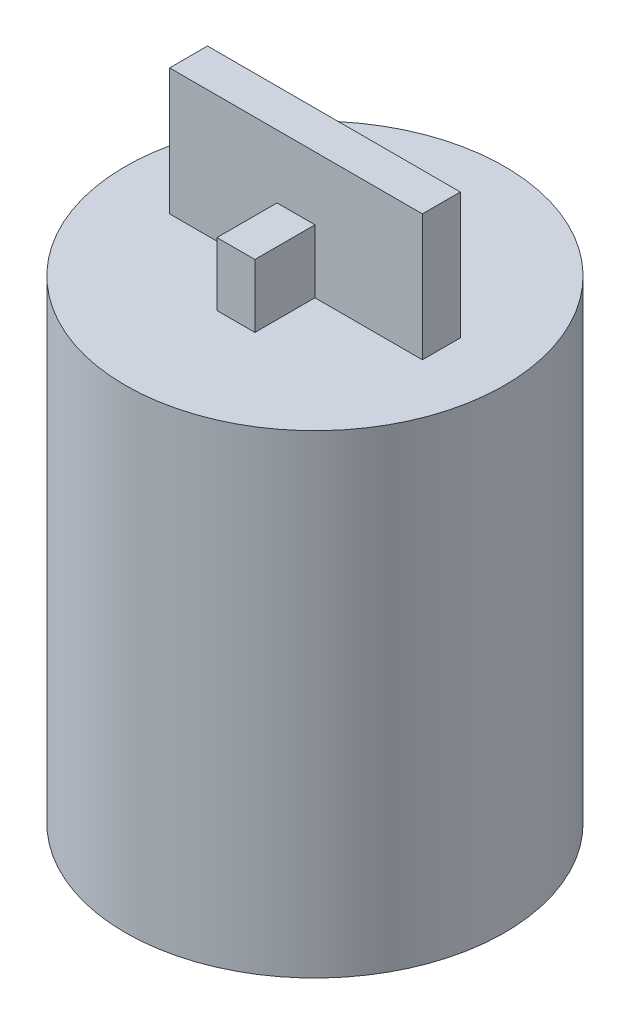
ISO-10303-21;
HEADER;
FILE_DESCRIPTION(('STEP AP214'),'2;1');
FILE_NAME('part.step','',(''),(''),'','','');
FILE_SCHEMA(('AUTOMOTIVE_DESIGN { 1 0 10303 214 1 1 1 1 }'));
ENDSEC;
DATA;
#1=APPLICATION_CONTEXT('core data for automotive mechanical design processes');
#2=APPLICATION_PROTOCOL_DEFINITION('international standard','automotive_design',2000,#1);
#3=PRODUCT_CONTEXT('',#1,'mechanical');
#4=PRODUCT('Part','Part','',(#3));
#5=PRODUCT_RELATED_PRODUCT_CATEGORY('part','',(#4));
#6=PRODUCT_DEFINITION_FORMATION('','',#4);
#7=PRODUCT_DEFINITION_CONTEXT('part definition',#1,'design');
#8=PRODUCT_DEFINITION('design','',#6,#7);
#9=PRODUCT_DEFINITION_SHAPE('','',#8);
#10=(LENGTH_UNIT() NAMED_UNIT(*) SI_UNIT(.MILLI.,.METRE.));
#11=(NAMED_UNIT(*) PLANE_ANGLE_UNIT() SI_UNIT($,.RADIAN.));
#12=(NAMED_UNIT(*) SI_UNIT($,.STERADIAN.) SOLID_ANGLE_UNIT());
#13=UNCERTAINTY_MEASURE_WITH_UNIT(LENGTH_MEASURE(1.E-05),#10,'distance_accuracy_value','');
#14=(GEOMETRIC_REPRESENTATION_CONTEXT(3) GLOBAL_UNCERTAINTY_ASSIGNED_CONTEXT((#13)) GLOBAL_UNIT_ASSIGNED_CONTEXT((#10,
#11,#12)) REPRESENTATION_CONTEXT('',''));
#15=CARTESIAN_POINT('',(0.,0.,0.));
#16=DIRECTION('',(0.,0.,1.));
#17=DIRECTION('',(1.,0.,0.));
#18=AXIS2_PLACEMENT_3D('',#15,#16,#17);
#19=CARTESIAN_POINT('',(0.,-7.5,0.));
#20=DIRECTION('',(0.,1.,0.));
#21=DIRECTION('',(0.,0.,1.));
#22=AXIS2_PLACEMENT_3D('',#19,#20,#21);
#23=PLANE('',#22);
#24=CARTESIAN_POINT('',(0.,-7.5,0.));
#25=DIRECTION('',(0.,1.,0.));
#26=DIRECTION('',(0.,0.,1.));
#27=AXIS2_PLACEMENT_3D('',#24,#25,#26);
#28=CIRCLE('',#27,3.);
#29=CARTESIAN_POINT('',(0.,-7.5,3.));
#30=VERTEX_POINT('',#29);
#31=EDGE_CURVE('E313',#30,#30,#28,.T.);
#32=ORIENTED_EDGE('',*,*,#31,.F.);
#33=EDGE_LOOP('',(#32));
#34=FACE_BOUND('',#33,.T.);
#35=DIRECTION('',(0.,0.,1.));
#36=VECTOR('',#35,1.);
#37=CARTESIAN_POINT('',(-1.13002976164114,-7.5,-2.23002976164114));
#38=LINE('',#37,#36);
#39=CARTESIAN_POINT('',(-1.13002976164114,-7.5,-2.23002976164114));
#40=VERTEX_POINT('',#39);
#41=CARTESIAN_POINT('',(-1.13002976164114,-7.5,-1.13002976164114));
#42=VERTEX_POINT('',#41);
#43=EDGE_CURVE('E288',#40,#42,#38,.T.);
#44=ORIENTED_EDGE('',*,*,#43,.T.);
#45=DIRECTION('',(-1.,0.,0.));
#46=VECTOR('',#45,1.);
#47=CARTESIAN_POINT('',(2.23002976164114,-7.5,-1.13002976164114));
#48=LINE('',#47,#46);
#49=CARTESIAN_POINT('',(-2.23002976164114,-7.5,-1.13002976164114));
#50=VERTEX_POINT('',#49);
#51=EDGE_CURVE('E240',#42,#50,#48,.T.);
#52=ORIENTED_EDGE('',*,*,#51,.T.);
#53=CARTESIAN_POINT('',(0.,-7.5,0.));
#54=DIRECTION('',(0.,-1.,0.));
#55=DIRECTION('',(0.,0.,-1.));
#56=AXIS2_PLACEMENT_3D('',#53,#54,#55);
#57=CIRCLE('',#56,2.5);
#58=CARTESIAN_POINT('',(-2.23002976164114,-7.5,1.13002976164114));
#59=VERTEX_POINT('',#58);
#60=EDGE_CURVE('E264',#59,#50,#57,.T.);
#61=ORIENTED_EDGE('',*,*,#60,.F.);
#62=DIRECTION('',(-1.,0.,0.));
#63=VECTOR('',#62,1.);
#64=CARTESIAN_POINT('',(2.23002976164114,-7.5,1.13002976164114));
#65=LINE('',#64,#63);
#66=CARTESIAN_POINT('',(-1.13002976164114,-7.5,1.13002976164114));
#67=VERTEX_POINT('',#66);
#68=EDGE_CURVE('E305',#67,#59,#65,.T.);
#69=ORIENTED_EDGE('',*,*,#68,.F.);
#70=CARTESIAN_POINT('',(-1.13002976164114,-7.5,2.23002976164114));
#71=VERTEX_POINT('',#70);
#72=EDGE_CURVE('E292',#67,#71,#38,.T.);
#73=ORIENTED_EDGE('',*,*,#72,.T.);
#74=CARTESIAN_POINT('',(0.,-7.5,0.));
#75=DIRECTION('',(0.,-1.,0.));
#76=DIRECTION('',(0.,0.,-1.));
#77=AXIS2_PLACEMENT_3D('',#74,#75,#76);
#78=CIRCLE('',#77,2.5);
#79=CARTESIAN_POINT('',(1.13002976164114,-7.5,2.23002976164114));
#80=VERTEX_POINT('',#79);
#81=EDGE_CURVE('E254',#80,#71,#78,.T.);
#82=ORIENTED_EDGE('',*,*,#81,.F.);
#83=DIRECTION('',(0.,0.,1.));
#84=VECTOR('',#83,1.);
#85=CARTESIAN_POINT('',(1.13002976164114,-7.5,-2.23002976164114));
#86=LINE('',#85,#84);
#87=CARTESIAN_POINT('',(1.13002976164114,-7.5,1.13002976164114));
#88=VERTEX_POINT('',#87);
#89=EDGE_CURVE('E287',#88,#80,#86,.T.);
#90=ORIENTED_EDGE('',*,*,#89,.F.);
#91=CARTESIAN_POINT('',(2.23002976164114,-7.5,1.13002976164114));
#92=VERTEX_POINT('',#91);
#93=EDGE_CURVE('E303',#92,#88,#65,.T.);
#94=ORIENTED_EDGE('',*,*,#93,.F.);
#95=CARTESIAN_POINT('',(0.,-7.5,0.));
#96=DIRECTION('',(0.,-1.,0.));
#97=DIRECTION('',(0.,0.,-1.));
#98=AXIS2_PLACEMENT_3D('',#95,#96,#97);
#99=CIRCLE('',#98,2.5);
#100=CARTESIAN_POINT('',(2.23002976164114,-7.5,-1.13002976164114));
#101=VERTEX_POINT('',#100);
#102=EDGE_CURVE('E78',#101,#92,#99,.T.);
#103=ORIENTED_EDGE('',*,*,#102,.F.);
#104=CARTESIAN_POINT('',(1.13002976164114,-7.5,-1.13002976164114));
#105=VERTEX_POINT('',#104);
#106=EDGE_CURVE('E306',#101,#105,#48,.T.);
#107=ORIENTED_EDGE('',*,*,#106,.T.);
#108=CARTESIAN_POINT('',(1.13002976164114,-7.5,-2.23002976164114));
#109=VERTEX_POINT('',#108);
#110=EDGE_CURVE('E283',#109,#105,#86,.T.);
#111=ORIENTED_EDGE('',*,*,#110,.F.);
#112=CARTESIAN_POINT('',(0.,-7.5,0.));
#113=DIRECTION('',(0.,-1.,0.));
#114=DIRECTION('',(0.,0.,-1.));
#115=AXIS2_PLACEMENT_3D('',#112,#113,#114);
#116=CIRCLE('',#115,2.5);
#117=EDGE_CURVE('E274',#40,#109,#116,.T.);
#118=ORIENTED_EDGE('',*,*,#117,.F.);
#119=EDGE_LOOP('',(#44,#52,#61,#69,#73,#82,#90,#94,#103,#107,#111,#118));
#120=FACE_BOUND('',#119,.T.);
#121=ADVANCED_FACE('F63',(#34,#120),#23,.F.);
#122=CARTESIAN_POINT('',(-2.,2.,-0.3));
#123=DIRECTION('',(1.,0.,0.));
#124=DIRECTION('',(0.,0.,-1.));
#125=AXIS2_PLACEMENT_3D('',#122,#123,#124);
#126=PLANE('',#125);
#127=DIRECTION('',(0.,0.,1.));
#128=VECTOR('',#127,1.);
#129=CARTESIAN_POINT('',(-2.,0.,-0.3));
#130=LINE('',#129,#128);
#131=CARTESIAN_POINT('',(-2.,0.,-0.3));
#132=VERTEX_POINT('',#131);
#133=CARTESIAN_POINT('',(-2.,0.,0.3));
#134=VERTEX_POINT('',#133);
#135=EDGE_CURVE('E366',#132,#134,#130,.T.);
#136=ORIENTED_EDGE('',*,*,#135,.T.);
#137=DIRECTION('',(0.,-1.,0.));
#138=VECTOR('',#137,1.);
#139=CARTESIAN_POINT('',(-2.,2.,0.3));
#140=LINE('',#139,#138);
#141=CARTESIAN_POINT('',(-2.,2.,0.3));
#142=VERTEX_POINT('',#141);
#143=EDGE_CURVE('E71',#142,#134,#140,.T.);
#144=ORIENTED_EDGE('',*,*,#143,.F.);
#145=DIRECTION('',(0.,0.,1.));
#146=VECTOR('',#145,1.);
#147=CARTESIAN_POINT('',(-2.,2.,-0.3));
#148=LINE('',#147,#146);
#149=CARTESIAN_POINT('',(-2.,2.,-0.3));
#150=VERTEX_POINT('',#149);
#151=EDGE_CURVE('E367',#150,#142,#148,.T.);
#152=ORIENTED_EDGE('',*,*,#151,.F.);
#153=DIRECTION('',(0.,-1.,0.));
#154=VECTOR('',#153,1.);
#155=CARTESIAN_POINT('',(-2.,2.,-0.3));
#156=LINE('',#155,#154);
#157=EDGE_CURVE('E379',#150,#132,#156,.T.);
#158=ORIENTED_EDGE('',*,*,#157,.T.);
#159=EDGE_LOOP('',(#136,#144,#152,#158));
#160=FACE_BOUND('',#159,.T.);
#161=ADVANCED_FACE('F65',(#160),#126,.F.);
#162=CARTESIAN_POINT('',(-2.,2.,0.3));
#163=DIRECTION('',(0.,0.,-1.));
#164=DIRECTION('',(-1.,0.,0.));
#165=AXIS2_PLACEMENT_3D('',#162,#163,#164);
#166=PLANE('',#165);
#167=DIRECTION('',(1.,0.,0.));
#168=VECTOR('',#167,1.);
#169=CARTESIAN_POINT('',(-2.,0.,0.3));
#170=LINE('',#169,#168);
#171=CARTESIAN_POINT('',(-0.299999999999999,0.,0.3));
#172=VERTEX_POINT('',#171);
#173=EDGE_CURVE('E383',#134,#172,#170,.T.);
#174=ORIENTED_EDGE('',*,*,#173,.T.);
#175=DIRECTION('',(0.,1.,0.));
#176=VECTOR('',#175,1.);
#177=CARTESIAN_POINT('',(-0.299999999999999,2.,0.3));
#178=LINE('',#177,#176);
#179=CARTESIAN_POINT('',(-0.299999999999999,1.,0.3));
#180=VERTEX_POINT('',#179);
#181=EDGE_CURVE('E86',#172,#180,#178,.T.);
#182=ORIENTED_EDGE('',*,*,#181,.T.);
#183=DIRECTION('',(-1.,0.,0.));
#184=VECTOR('',#183,1.);
#185=CARTESIAN_POINT('',(-2.,1.,0.3));
#186=LINE('',#185,#184);
#187=CARTESIAN_POINT('',(0.300000000000001,1.,0.3));
#188=VERTEX_POINT('',#187);
#189=EDGE_CURVE('E364',#188,#180,#186,.T.);
#190=ORIENTED_EDGE('',*,*,#189,.F.);
#191=DIRECTION('',(0.,1.,0.));
#192=VECTOR('',#191,1.);
#193=CARTESIAN_POINT('',(0.300000000000001,2.,0.3));
#194=LINE('',#193,#192);
#195=CARTESIAN_POINT('',(0.300000000000001,0.,0.3));
#196=VERTEX_POINT('',#195);
#197=EDGE_CURVE('E358',#196,#188,#194,.T.);
#198=ORIENTED_EDGE('',*,*,#197,.F.);
#199=CARTESIAN_POINT('',(2.,0.,0.3));
#200=VERTEX_POINT('',#199);
#201=EDGE_CURVE('E382',#196,#200,#170,.T.);
#202=ORIENTED_EDGE('',*,*,#201,.T.);
#203=DIRECTION('',(0.,-1.,0.));
#204=VECTOR('',#203,1.);
#205=CARTESIAN_POINT('',(2.,2.,0.3));
#206=LINE('',#205,#204);
#207=CARTESIAN_POINT('',(2.,2.,0.3));
#208=VERTEX_POINT('',#207);
#209=EDGE_CURVE('E394',#208,#200,#206,.T.);
#210=ORIENTED_EDGE('',*,*,#209,.F.);
#211=DIRECTION('',(1.,0.,0.));
#212=VECTOR('',#211,1.);
#213=CARTESIAN_POINT('',(-2.,2.,0.3));
#214=LINE('',#213,#212);
#215=EDGE_CURVE('E370',#142,#208,#214,.T.);
#216=ORIENTED_EDGE('',*,*,#215,.F.);
#217=ORIENTED_EDGE('',*,*,#143,.T.);
#218=EDGE_LOOP('',(#174,#182,#190,#198,#202,#210,#216,#217));
#219=FACE_BOUND('',#218,.T.);
#220=ADVANCED_FACE('F398',(#219),#166,.F.);
#221=CARTESIAN_POINT('',(2.,2.,-0.3));
#222=DIRECTION('',(1.,0.,0.));
#223=DIRECTION('',(0.,0.,-1.));
#224=AXIS2_PLACEMENT_3D('',#221,#222,#223);
#225=PLANE('',#224);
#226=DIRECTION('',(0.,0.,1.));
#227=VECTOR('',#226,1.);
#228=CARTESIAN_POINT('',(2.,0.,-0.3));
#229=LINE('',#228,#227);
#230=CARTESIAN_POINT('',(2.,0.,-0.3));
#231=VERTEX_POINT('',#230);
#232=EDGE_CURVE('E385',#231,#200,#229,.T.);
#233=ORIENTED_EDGE('',*,*,#232,.F.);
#234=DIRECTION('',(0.,-1.,0.));
#235=VECTOR('',#234,1.);
#236=CARTESIAN_POINT('',(2.,2.,-0.3));
#237=LINE('',#236,#235);
#238=CARTESIAN_POINT('',(2.,2.,-0.3));
#239=VERTEX_POINT('',#238);
#240=EDGE_CURVE('E391',#239,#231,#237,.T.);
#241=ORIENTED_EDGE('',*,*,#240,.F.);
#242=DIRECTION('',(0.,0.,1.));
#243=VECTOR('',#242,1.);
#244=CARTESIAN_POINT('',(2.,2.,-0.3));
#245=LINE('',#244,#243);
#246=EDGE_CURVE('E373',#239,#208,#245,.T.);
#247=ORIENTED_EDGE('',*,*,#246,.T.);
#248=ORIENTED_EDGE('',*,*,#209,.T.);
#249=EDGE_LOOP('',(#233,#241,#247,#248));
#250=FACE_BOUND('',#249,.T.);
#251=ADVANCED_FACE('F475',(#250),#225,.T.);
#252=CARTESIAN_POINT('',(-2.,2.,-0.3));
#253=DIRECTION('',(0.,0.,-1.));
#254=DIRECTION('',(-1.,0.,0.));
#255=AXIS2_PLACEMENT_3D('',#252,#253,#254);
#256=PLANE('',#255);
#257=DIRECTION('',(0.,1.,0.));
#258=VECTOR('',#257,1.);
#259=CARTESIAN_POINT('',(-0.299999999999999,2.,-0.3));
#260=LINE('',#259,#258);
#261=CARTESIAN_POINT('',(-0.299999999999999,0.,-0.3));
#262=VERTEX_POINT('',#261);
#263=CARTESIAN_POINT('',(-0.299999999999999,1.,-0.3));
#264=VERTEX_POINT('',#263);
#265=EDGE_CURVE('E361',#262,#264,#260,.T.);
#266=ORIENTED_EDGE('',*,*,#265,.F.);
#267=DIRECTION('',(1.,0.,0.));
#268=VECTOR('',#267,1.);
#269=CARTESIAN_POINT('',(-2.,0.,-0.3));
#270=LINE('',#269,#268);
#271=EDGE_CURVE('E371',#132,#262,#270,.T.);
#272=ORIENTED_EDGE('',*,*,#271,.F.);
#273=ORIENTED_EDGE('',*,*,#157,.F.);
#274=DIRECTION('',(1.,0.,0.));
#275=VECTOR('',#274,1.);
#276=CARTESIAN_POINT('',(-2.,2.,-0.3));
#277=LINE('',#276,#275);
#278=EDGE_CURVE('E376',#150,#239,#277,.T.);
#279=ORIENTED_EDGE('',*,*,#278,.T.);
#280=ORIENTED_EDGE('',*,*,#240,.T.);
#281=CARTESIAN_POINT('',(0.300000000000001,0.,-0.3));
#282=VERTEX_POINT('',#281);
#283=EDGE_CURVE('E387',#282,#231,#270,.T.);
#284=ORIENTED_EDGE('',*,*,#283,.F.);
#285=DIRECTION('',(0.,1.,0.));
#286=VECTOR('',#285,1.);
#287=CARTESIAN_POINT('',(0.300000000000001,2.,-0.3));
#288=LINE('',#287,#286);
#289=CARTESIAN_POINT('',(0.300000000000001,1.,-0.3));
#290=VERTEX_POINT('',#289);
#291=EDGE_CURVE('E347',#282,#290,#288,.T.);
#292=ORIENTED_EDGE('',*,*,#291,.T.);
#293=DIRECTION('',(-1.,0.,0.));
#294=VECTOR('',#293,1.);
#295=CARTESIAN_POINT('',(-2.,1.,-0.3));
#296=LINE('',#295,#294);
#297=EDGE_CURVE('E13',#290,#264,#296,.T.);
#298=ORIENTED_EDGE('',*,*,#297,.T.);
#299=EDGE_LOOP('',(#266,#272,#273,#279,#280,#284,#292,#298));
#300=FACE_BOUND('',#299,.T.);
#301=ADVANCED_FACE('F471',(#300),#256,.T.);
#302=CARTESIAN_POINT('',(0.,2.,0.));
#303=DIRECTION('',(0.,1.,0.));
#304=DIRECTION('',(0.,0.,1.));
#305=AXIS2_PLACEMENT_3D('',#302,#303,#304);
#306=PLANE('',#305);
#307=ORIENTED_EDGE('',*,*,#151,.T.);
#308=ORIENTED_EDGE('',*,*,#215,.T.);
#309=ORIENTED_EDGE('',*,*,#246,.F.);
#310=ORIENTED_EDGE('',*,*,#278,.F.);
#311=EDGE_LOOP('',(#307,#308,#309,#310));
#312=FACE_BOUND('',#311,.T.);
#313=ADVANCED_FACE('F456',(#312),#306,.T.);
#314=CARTESIAN_POINT('',(-0.299999999999999,1.,-1.25));
#315=DIRECTION('',(0.,0.,-1.));
#316=DIRECTION('',(-1.,0.,0.));
#317=AXIS2_PLACEMENT_3D('',#314,#315,#316);
#318=PLANE('',#317);
#319=DIRECTION('',(1.,0.,0.));
#320=VECTOR('',#319,1.);
#321=CARTESIAN_POINT('',(-0.299999999999999,0.,-1.25));
#322=LINE('',#321,#320);
#323=CARTESIAN_POINT('',(-0.299999999999999,0.,-1.25));
#324=VERTEX_POINT('',#323);
#325=CARTESIAN_POINT('',(0.300000000000001,0.,-1.25));
#326=VERTEX_POINT('',#325);
#327=EDGE_CURVE('E335',#324,#326,#322,.T.);
#328=ORIENTED_EDGE('',*,*,#327,.F.);
#329=DIRECTION('',(0.,-1.,0.));
#330=VECTOR('',#329,1.);
#331=CARTESIAN_POINT('',(-0.299999999999999,1.,-1.25));
#332=LINE('',#331,#330);
#333=CARTESIAN_POINT('',(-0.299999999999999,1.,-1.25));
#334=VERTEX_POINT('',#333);
#335=EDGE_CURVE('E332',#334,#324,#332,.T.);
#336=ORIENTED_EDGE('',*,*,#335,.F.);
#337=DIRECTION('',(1.,0.,0.));
#338=VECTOR('',#337,1.);
#339=CARTESIAN_POINT('',(-0.299999999999999,1.,-1.25));
#340=LINE('',#339,#338);
#341=CARTESIAN_POINT('',(0.300000000000001,1.,-1.25));
#342=VERTEX_POINT('',#341);
#343=EDGE_CURVE('E322',#334,#342,#340,.T.);
#344=ORIENTED_EDGE('',*,*,#343,.T.);
#345=DIRECTION('',(0.,-1.,0.));
#346=VECTOR('',#345,1.);
#347=CARTESIAN_POINT('',(0.300000000000001,1.,-1.25));
#348=LINE('',#347,#346);
#349=EDGE_CURVE('E351',#342,#326,#348,.T.);
#350=ORIENTED_EDGE('',*,*,#349,.T.);
#351=EDGE_LOOP('',(#328,#336,#344,#350));
#352=FACE_BOUND('',#351,.T.);
#353=ADVANCED_FACE('F448',(#352),#318,.T.);
#354=CARTESIAN_POINT('',(0.,1.,0.));
#355=DIRECTION('',(0.,-1.,0.));
#356=DIRECTION('',(0.,0.,-1.));
#357=AXIS2_PLACEMENT_3D('',#354,#355,#356);
#358=PLANE('',#357);
#359=ORIENTED_EDGE('',*,*,#297,.F.);
#360=DIRECTION('',(0.,0.,-1.));
#361=VECTOR('',#360,1.);
#362=CARTESIAN_POINT('',(0.300000000000001,1.,1.25));
#363=LINE('',#362,#361);
#364=EDGE_CURVE('E326',#290,#342,#363,.T.);
#365=ORIENTED_EDGE('',*,*,#364,.T.);
#366=ORIENTED_EDGE('',*,*,#343,.F.);
#367=DIRECTION('',(0.,0.,-1.));
#368=VECTOR('',#367,1.);
#369=CARTESIAN_POINT('',(-0.299999999999999,1.,1.25));
#370=LINE('',#369,#368);
#371=EDGE_CURVE('E323',#264,#334,#370,.T.);
#372=ORIENTED_EDGE('',*,*,#371,.F.);
#373=EDGE_LOOP('',(#359,#365,#366,#372));
#374=FACE_BOUND('',#373,.T.);
#375=ADVANCED_FACE('F446',(#374),#358,.F.);
#376=CARTESIAN_POINT('',(0.300000000000001,1.,1.25));
#377=DIRECTION('',(-1.,0.,0.));
#378=DIRECTION('',(0.,0.,1.));
#379=AXIS2_PLACEMENT_3D('',#376,#377,#378);
#380=PLANE('',#379);
#381=ORIENTED_EDGE('',*,*,#291,.F.);
#382=DIRECTION('',(0.,0.,-1.));
#383=VECTOR('',#382,1.);
#384=CARTESIAN_POINT('',(0.300000000000001,0.,1.25));
#385=LINE('',#384,#383);
#386=EDGE_CURVE('E337',#282,#326,#385,.T.);
#387=ORIENTED_EDGE('',*,*,#386,.T.);
#388=ORIENTED_EDGE('',*,*,#349,.F.);
#389=ORIENTED_EDGE('',*,*,#364,.F.);
#390=EDGE_LOOP('',(#381,#387,#388,#389));
#391=FACE_BOUND('',#390,.T.);
#392=ADVANCED_FACE('F432',(#391),#380,.F.);
#393=CARTESIAN_POINT('',(-0.299999999999999,1.,1.25));
#394=DIRECTION('',(-1.,0.,0.));
#395=DIRECTION('',(0.,0.,1.));
#396=AXIS2_PLACEMENT_3D('',#393,#394,#395);
#397=PLANE('',#396);
#398=DIRECTION('',(0.,0.,-1.));
#399=VECTOR('',#398,1.);
#400=CARTESIAN_POINT('',(-0.299999999999999,0.,1.25));
#401=LINE('',#400,#399);
#402=EDGE_CURVE('E316',#262,#324,#401,.T.);
#403=ORIENTED_EDGE('',*,*,#402,.F.);
#404=ORIENTED_EDGE('',*,*,#265,.T.);
#405=ORIENTED_EDGE('',*,*,#371,.T.);
#406=ORIENTED_EDGE('',*,*,#335,.T.);
#407=EDGE_LOOP('',(#403,#404,#405,#406));
#408=FACE_BOUND('',#407,.T.);
#409=ADVANCED_FACE('F454',(#408),#397,.T.);
#410=CARTESIAN_POINT('',(0.300000000000001,1.,1.25));
#411=VERTEX_POINT('',#410);
#412=EDGE_CURVE('E327',#411,#188,#363,.T.);
#413=ORIENTED_EDGE('',*,*,#412,.T.);
#414=ORIENTED_EDGE('',*,*,#189,.T.);
#415=CARTESIAN_POINT('',(-0.299999999999999,1.,1.25));
#416=VERTEX_POINT('',#415);
#417=EDGE_CURVE('E319',#416,#180,#370,.T.);
#418=ORIENTED_EDGE('',*,*,#417,.F.);
#419=DIRECTION('',(1.,0.,0.));
#420=VECTOR('',#419,1.);
#421=CARTESIAN_POINT('',(-0.299999999999999,1.,1.25));
#422=LINE('',#421,#420);
#423=EDGE_CURVE('E330',#416,#411,#422,.T.);
#424=ORIENTED_EDGE('',*,*,#423,.T.);
#425=EDGE_LOOP('',(#413,#414,#418,#424));
#426=FACE_BOUND('',#425,.T.);
#427=ADVANCED_FACE('F413',(#426),#358,.F.);
#428=ORIENTED_EDGE('',*,*,#181,.F.);
#429=CARTESIAN_POINT('',(-0.299999999999999,0.,1.25));
#430=VERTEX_POINT('',#429);
#431=EDGE_CURVE('E333',#430,#172,#401,.T.);
#432=ORIENTED_EDGE('',*,*,#431,.F.);
#433=DIRECTION('',(0.,-1.,0.));
#434=VECTOR('',#433,1.);
#435=CARTESIAN_POINT('',(-0.299999999999999,1.,1.25));
#436=LINE('',#435,#434);
#437=EDGE_CURVE('E344',#416,#430,#436,.T.);
#438=ORIENTED_EDGE('',*,*,#437,.F.);
#439=ORIENTED_EDGE('',*,*,#417,.T.);
#440=EDGE_LOOP('',(#428,#432,#438,#439));
#441=FACE_BOUND('',#440,.T.);
#442=ADVANCED_FACE('F409',(#441),#397,.T.);
#443=CARTESIAN_POINT('',(0.300000000000001,0.,1.25));
#444=VERTEX_POINT('',#443);
#445=EDGE_CURVE('E338',#444,#196,#385,.T.);
#446=ORIENTED_EDGE('',*,*,#445,.T.);
#447=ORIENTED_EDGE('',*,*,#197,.T.);
#448=ORIENTED_EDGE('',*,*,#412,.F.);
#449=DIRECTION('',(0.,-1.,0.));
#450=VECTOR('',#449,1.);
#451=CARTESIAN_POINT('',(0.300000000000001,1.,1.25));
#452=LINE('',#451,#450);
#453=EDGE_CURVE('E348',#411,#444,#452,.T.);
#454=ORIENTED_EDGE('',*,*,#453,.T.);
#455=EDGE_LOOP('',(#446,#447,#448,#454));
#456=FACE_BOUND('',#455,.T.);
#457=ADVANCED_FACE('F419',(#456),#380,.F.);
#458=CARTESIAN_POINT('',(-0.299999999999999,1.,1.25));
#459=DIRECTION('',(0.,0.,-1.));
#460=DIRECTION('',(-1.,0.,0.));
#461=AXIS2_PLACEMENT_3D('',#458,#459,#460);
#462=PLANE('',#461);
#463=DIRECTION('',(1.,0.,0.));
#464=VECTOR('',#463,1.);
#465=CARTESIAN_POINT('',(-0.299999999999999,0.,1.25));
#466=LINE('',#465,#464);
#467=EDGE_CURVE('E341',#430,#444,#466,.T.);
#468=ORIENTED_EDGE('',*,*,#467,.T.);
#469=ORIENTED_EDGE('',*,*,#453,.F.);
#470=ORIENTED_EDGE('',*,*,#423,.F.);
#471=ORIENTED_EDGE('',*,*,#437,.T.);
#472=EDGE_LOOP('',(#468,#469,#470,#471));
#473=FACE_BOUND('',#472,.T.);
#474=ADVANCED_FACE('F421',(#473),#462,.F.);
#475=CARTESIAN_POINT('',(0.,-7.5,0.));
#476=DIRECTION('',(0.,1.,0.));
#477=DIRECTION('',(0.,0.,1.));
#478=AXIS2_PLACEMENT_3D('',#475,#476,#477);
#479=CYLINDRICAL_SURFACE('',#478,3.);
#480=ORIENTED_EDGE('',*,*,#31,.T.);
#481=EDGE_LOOP('',(#480));
#482=FACE_BOUND('',#481,.T.);
#483=CARTESIAN_POINT('',(0.,0.,0.));
#484=DIRECTION('',(0.,1.,0.));
#485=DIRECTION('',(0.,0.,1.));
#486=AXIS2_PLACEMENT_3D('',#483,#484,#485);
#487=CIRCLE('',#486,3.);
#488=CARTESIAN_POINT('',(0.,0.,3.));
#489=VERTEX_POINT('',#488);
#490=EDGE_CURVE('E253',#489,#489,#487,.T.);
#491=ORIENTED_EDGE('',*,*,#490,.F.);
#492=EDGE_LOOP('',(#491));
#493=FACE_BOUND('',#492,.T.);
#494=ADVANCED_FACE('F423',(#482,#493),#479,.T.);
#495=CARTESIAN_POINT('',(0.,0.,0.));
#496=DIRECTION('',(0.,1.,0.));
#497=DIRECTION('',(0.,0.,1.));
#498=AXIS2_PLACEMENT_3D('',#495,#496,#497);
#499=PLANE('',#498);
#500=ORIENTED_EDGE('',*,*,#135,.F.);
#501=ORIENTED_EDGE('',*,*,#271,.T.);
#502=ORIENTED_EDGE('',*,*,#402,.T.);
#503=ORIENTED_EDGE('',*,*,#327,.T.);
#504=ORIENTED_EDGE('',*,*,#386,.F.);
#505=ORIENTED_EDGE('',*,*,#283,.T.);
#506=ORIENTED_EDGE('',*,*,#232,.T.);
#507=ORIENTED_EDGE('',*,*,#201,.F.);
#508=ORIENTED_EDGE('',*,*,#445,.F.);
#509=ORIENTED_EDGE('',*,*,#467,.F.);
#510=ORIENTED_EDGE('',*,*,#431,.T.);
#511=ORIENTED_EDGE('',*,*,#173,.F.);
#512=EDGE_LOOP('',(#500,#501,#502,#503,#504,#505,#506,#507,#508,#509,#510,#511));
#513=FACE_BOUND('',#512,.T.);
#514=ORIENTED_EDGE('',*,*,#490,.T.);
#515=EDGE_LOOP('',(#514));
#516=FACE_BOUND('',#515,.T.);
#517=ADVANCED_FACE('F404',(#513,#516),#499,.T.);
#518=CARTESIAN_POINT('',(0.,-1.,0.));
#519=DIRECTION('',(0.,1.,0.));
#520=DIRECTION('',(0.,0.,1.));
#521=AXIS2_PLACEMENT_3D('',#518,#519,#520);
#522=PLANE('',#521);
#523=CARTESIAN_POINT('',(0.,-1.,0.));
#524=DIRECTION('',(0.,1.,0.));
#525=DIRECTION('',(0.,0.,1.));
#526=AXIS2_PLACEMENT_3D('',#523,#524,#525);
#527=CIRCLE('',#526,2.5);
#528=CARTESIAN_POINT('',(2.23002976164114,-1.,-1.13002976164114));
#529=VERTEX_POINT('',#528);
#530=CARTESIAN_POINT('',(2.23002976164114,-1.,1.13002976164114));
#531=VERTEX_POINT('',#530);
#532=EDGE_CURVE('E227',#529,#531,#527,.F.);
#533=ORIENTED_EDGE('',*,*,#532,.T.);
#534=DIRECTION('',(-1.,0.,0.));
#535=VECTOR('',#534,1.);
#536=CARTESIAN_POINT('',(2.23002976164114,-1.,1.13002976164114));
#537=LINE('',#536,#535);
#538=CARTESIAN_POINT('',(1.13002976164114,-1.,1.13002976164114));
#539=VERTEX_POINT('',#538);
#540=EDGE_CURVE('E234',#531,#539,#537,.T.);
#541=ORIENTED_EDGE('',*,*,#540,.T.);
#542=DIRECTION('',(0.,0.,1.));
#543=VECTOR('',#542,1.);
#544=CARTESIAN_POINT('',(1.13002976164114,-1.,-2.23002976164114));
#545=LINE('',#544,#543);
#546=CARTESIAN_POINT('',(1.13002976164114,-1.,2.23002976164114));
#547=VERTEX_POINT('',#546);
#548=EDGE_CURVE('E286',#539,#547,#545,.T.);
#549=ORIENTED_EDGE('',*,*,#548,.T.);
#550=CARTESIAN_POINT('',(0.,-1.,0.));
#551=DIRECTION('',(0.,1.,0.));
#552=DIRECTION('',(0.,0.,1.));
#553=AXIS2_PLACEMENT_3D('',#550,#551,#552);
#554=CIRCLE('',#553,2.5);
#555=CARTESIAN_POINT('',(-1.13002976164114,-1.,2.23002976164114));
#556=VERTEX_POINT('',#555);
#557=EDGE_CURVE('E257',#547,#556,#554,.F.);
#558=ORIENTED_EDGE('',*,*,#557,.T.);
#559=DIRECTION('',(0.,0.,1.));
#560=VECTOR('',#559,1.);
#561=CARTESIAN_POINT('',(-1.13002976164114,-1.,-2.23002976164114));
#562=LINE('',#561,#560);
#563=CARTESIAN_POINT('',(-1.13002976164114,-1.,1.13002976164114));
#564=VERTEX_POINT('',#563);
#565=EDGE_CURVE('E298',#564,#556,#562,.T.);
#566=ORIENTED_EDGE('',*,*,#565,.F.);
#567=CARTESIAN_POINT('',(-2.23002976164114,-1.,1.13002976164114));
#568=VERTEX_POINT('',#567);
#569=EDGE_CURVE('E241',#564,#568,#537,.T.);
#570=ORIENTED_EDGE('',*,*,#569,.T.);
#571=CARTESIAN_POINT('',(0.,-1.,0.));
#572=DIRECTION('',(0.,1.,0.));
#573=DIRECTION('',(0.,0.,1.));
#574=AXIS2_PLACEMENT_3D('',#571,#572,#573);
#575=CIRCLE('',#574,2.5);
#576=CARTESIAN_POINT('',(-2.23002976164114,-1.,-1.13002976164114));
#577=VERTEX_POINT('',#576);
#578=EDGE_CURVE('E267',#568,#577,#575,.F.);
#579=ORIENTED_EDGE('',*,*,#578,.T.);
#580=DIRECTION('',(-1.,0.,0.));
#581=VECTOR('',#580,1.);
#582=CARTESIAN_POINT('',(2.23002976164114,-1.,-1.13002976164114));
#583=LINE('',#582,#581);
#584=CARTESIAN_POINT('',(-1.13002976164114,-1.,-1.13002976164114));
#585=VERTEX_POINT('',#584);
#586=EDGE_CURVE('E310',#585,#577,#583,.T.);
#587=ORIENTED_EDGE('',*,*,#586,.F.);
#588=CARTESIAN_POINT('',(-1.13002976164114,-1.,-2.23002976164114));
#589=VERTEX_POINT('',#588);
#590=EDGE_CURVE('E295',#589,#585,#562,.T.);
#591=ORIENTED_EDGE('',*,*,#590,.F.);
#592=CARTESIAN_POINT('',(0.,-1.,0.));
#593=DIRECTION('',(0.,1.,0.));
#594=DIRECTION('',(0.,0.,1.));
#595=AXIS2_PLACEMENT_3D('',#592,#593,#594);
#596=CIRCLE('',#595,2.5);
#597=CARTESIAN_POINT('',(1.13002976164114,-1.,-2.23002976164114));
#598=VERTEX_POINT('',#597);
#599=EDGE_CURVE('E277',#589,#598,#596,.F.);
#600=ORIENTED_EDGE('',*,*,#599,.T.);
#601=CARTESIAN_POINT('',(1.13002976164114,-1.,-1.13002976164114));
#602=VERTEX_POINT('',#601);
#603=EDGE_CURVE('E293',#598,#602,#545,.T.);
#604=ORIENTED_EDGE('',*,*,#603,.T.);
#605=EDGE_CURVE('E247',#529,#602,#583,.T.);
#606=ORIENTED_EDGE('',*,*,#605,.F.);
#607=EDGE_LOOP('',(#533,#541,#549,#558,#566,#570,#579,#587,#591,#600,#604,#606));
#608=FACE_BOUND('',#607,.T.);
#609=ADVANCED_FACE('F244',(#608),#522,.F.);
#610=CARTESIAN_POINT('',(0.,5.,0.));
#611=DIRECTION('',(0.,-1.,0.));
#612=DIRECTION('',(0.,0.,-1.));
#613=AXIS2_PLACEMENT_3D('',#610,#611,#612);
#614=CYLINDRICAL_SURFACE('',#613,2.5);
#615=DIRECTION('',(0.,-1.,0.));
#616=VECTOR('',#615,1.);
#617=CARTESIAN_POINT('',(2.23002976164114,5.,-1.13002976164114));
#618=LINE('',#617,#616);
#619=EDGE_CURVE('E231',#529,#101,#618,.T.);
#620=ORIENTED_EDGE('',*,*,#619,.T.);
#621=ORIENTED_EDGE('',*,*,#102,.T.);
#622=DIRECTION('',(0.,-1.,0.));
#623=VECTOR('',#622,1.);
#624=CARTESIAN_POINT('',(2.23002976164114,5.,1.13002976164114));
#625=LINE('',#624,#623);
#626=EDGE_CURVE('E223',#531,#92,#625,.T.);
#627=ORIENTED_EDGE('',*,*,#626,.F.);
#628=ORIENTED_EDGE('',*,*,#532,.F.);
#629=EDGE_LOOP('',(#620,#621,#627,#628));
#630=FACE_BOUND('',#629,.T.);
#631=ADVANCED_FACE('F225',(#630),#614,.F.);
#632=CARTESIAN_POINT('',(0.,5.,0.));
#633=DIRECTION('',(0.,-1.,0.));
#634=DIRECTION('',(0.,0.,-1.));
#635=AXIS2_PLACEMENT_3D('',#632,#633,#634);
#636=CYLINDRICAL_SURFACE('',#635,2.5);
#637=DIRECTION('',(0.,-1.,0.));
#638=VECTOR('',#637,1.);
#639=CARTESIAN_POINT('',(-2.23002976164114,5.,1.13002976164114));
#640=LINE('',#639,#638);
#641=EDGE_CURVE('E258',#568,#59,#640,.T.);
#642=ORIENTED_EDGE('',*,*,#641,.T.);
#643=ORIENTED_EDGE('',*,*,#60,.T.);
#644=DIRECTION('',(0.,-1.,0.));
#645=VECTOR('',#644,1.);
#646=CARTESIAN_POINT('',(-2.23002976164114,5.,-1.13002976164114));
#647=LINE('',#646,#645);
#648=EDGE_CURVE('E271',#577,#50,#647,.T.);
#649=ORIENTED_EDGE('',*,*,#648,.F.);
#650=ORIENTED_EDGE('',*,*,#578,.F.);
#651=EDGE_LOOP('',(#642,#643,#649,#650));
#652=FACE_BOUND('',#651,.T.);
#653=ADVANCED_FACE('F561',(#652),#636,.F.);
#654=CARTESIAN_POINT('',(-1.13002976164114,5.,-2.23002976164114));
#655=DIRECTION('',(1.,0.,0.));
#656=DIRECTION('',(0.,0.,-1.));
#657=AXIS2_PLACEMENT_3D('',#654,#655,#656);
#658=PLANE('',#657);
#659=DIRECTION('',(0.,-1.,0.));
#660=VECTOR('',#659,1.);
#661=CARTESIAN_POINT('',(-1.13002976164114,5.,-1.13002976164114));
#662=LINE('',#661,#660);
#663=EDGE_CURVE('E291',#585,#42,#662,.T.);
#664=ORIENTED_EDGE('',*,*,#663,.T.);
#665=ORIENTED_EDGE('',*,*,#43,.F.);
#666=DIRECTION('',(0.,-1.,0.));
#667=VECTOR('',#666,1.);
#668=CARTESIAN_POINT('',(-1.13002976164114,5.,-2.23002976164114));
#669=LINE('',#668,#667);
#670=EDGE_CURVE('E268',#589,#40,#669,.T.);
#671=ORIENTED_EDGE('',*,*,#670,.F.);
#672=ORIENTED_EDGE('',*,*,#590,.T.);
#673=EDGE_LOOP('',(#664,#665,#671,#672));
#674=FACE_BOUND('',#673,.T.);
#675=ADVANCED_FACE('F571',(#674),#658,.T.);
#676=CARTESIAN_POINT('',(2.23002976164114,5.,1.13002976164114));
#677=DIRECTION('',(0.,0.,1.));
#678=DIRECTION('',(1.,0.,0.));
#679=AXIS2_PLACEMENT_3D('',#676,#677,#678);
#680=PLANE('',#679);
#681=DIRECTION('',(0.,-1.,0.));
#682=VECTOR('',#681,1.);
#683=CARTESIAN_POINT('',(-1.13002976164114,5.,1.13002976164114));
#684=LINE('',#683,#682);
#685=EDGE_CURVE('E300',#564,#67,#684,.T.);
#686=ORIENTED_EDGE('',*,*,#685,.T.);
#687=ORIENTED_EDGE('',*,*,#68,.T.);
#688=ORIENTED_EDGE('',*,*,#641,.F.);
#689=ORIENTED_EDGE('',*,*,#569,.F.);
#690=EDGE_LOOP('',(#686,#687,#688,#689));
#691=FACE_BOUND('',#690,.T.);
#692=ADVANCED_FACE('F582',(#691),#680,.F.);
#693=CARTESIAN_POINT('',(2.23002976164114,5.,-1.13002976164114));
#694=DIRECTION('',(0.,0.,1.));
#695=DIRECTION('',(1.,0.,0.));
#696=AXIS2_PLACEMENT_3D('',#693,#694,#695);
#697=PLANE('',#696);
#698=ORIENTED_EDGE('',*,*,#586,.T.);
#699=ORIENTED_EDGE('',*,*,#648,.T.);
#700=ORIENTED_EDGE('',*,*,#51,.F.);
#701=ORIENTED_EDGE('',*,*,#663,.F.);
#702=EDGE_LOOP('',(#698,#699,#700,#701));
#703=FACE_BOUND('',#702,.T.);
#704=ADVANCED_FACE('F594',(#703),#697,.T.);
#705=ORIENTED_EDGE('',*,*,#565,.T.);
#706=DIRECTION('',(0.,-1.,0.));
#707=VECTOR('',#706,1.);
#708=CARTESIAN_POINT('',(-1.13002976164114,5.,2.23002976164114));
#709=LINE('',#708,#707);
#710=EDGE_CURVE('E261',#556,#71,#709,.T.);
#711=ORIENTED_EDGE('',*,*,#710,.T.);
#712=ORIENTED_EDGE('',*,*,#72,.F.);
#713=ORIENTED_EDGE('',*,*,#685,.F.);
#714=EDGE_LOOP('',(#705,#711,#712,#713));
#715=FACE_BOUND('',#714,.T.);
#716=ADVANCED_FACE('F585',(#715),#658,.T.);
#717=CARTESIAN_POINT('',(0.,5.,0.));
#718=DIRECTION('',(0.,-1.,0.));
#719=DIRECTION('',(0.,0.,-1.));
#720=AXIS2_PLACEMENT_3D('',#717,#718,#719);
#721=CYLINDRICAL_SURFACE('',#720,2.5);
#722=ORIENTED_EDGE('',*,*,#670,.T.);
#723=ORIENTED_EDGE('',*,*,#117,.T.);
#724=DIRECTION('',(0.,-1.,0.));
#725=VECTOR('',#724,1.);
#726=CARTESIAN_POINT('',(1.13002976164114,5.,-2.23002976164114));
#727=LINE('',#726,#725);
#728=EDGE_CURVE('E280',#598,#109,#727,.T.);
#729=ORIENTED_EDGE('',*,*,#728,.F.);
#730=ORIENTED_EDGE('',*,*,#599,.F.);
#731=EDGE_LOOP('',(#722,#723,#729,#730));
#732=FACE_BOUND('',#731,.T.);
#733=ADVANCED_FACE('F574',(#732),#721,.F.);
#734=CARTESIAN_POINT('',(0.,5.,0.));
#735=DIRECTION('',(0.,-1.,0.));
#736=DIRECTION('',(0.,0.,-1.));
#737=AXIS2_PLACEMENT_3D('',#734,#735,#736);
#738=CYLINDRICAL_SURFACE('',#737,2.5);
#739=DIRECTION('',(0.,-1.,0.));
#740=VECTOR('',#739,1.);
#741=CARTESIAN_POINT('',(1.13002976164114,5.,2.23002976164114));
#742=LINE('',#741,#740);
#743=EDGE_CURVE('E249',#547,#80,#742,.T.);
#744=ORIENTED_EDGE('',*,*,#743,.T.);
#745=ORIENTED_EDGE('',*,*,#81,.T.);
#746=ORIENTED_EDGE('',*,*,#710,.F.);
#747=ORIENTED_EDGE('',*,*,#557,.F.);
#748=EDGE_LOOP('',(#744,#745,#746,#747));
#749=FACE_BOUND('',#748,.T.);
#750=ADVANCED_FACE('F563',(#749),#738,.F.);
#751=CARTESIAN_POINT('',(1.13002976164114,5.,-2.23002976164114));
#752=DIRECTION('',(1.,0.,0.));
#753=DIRECTION('',(0.,0.,-1.));
#754=AXIS2_PLACEMENT_3D('',#751,#752,#753);
#755=PLANE('',#754);
#756=ORIENTED_EDGE('',*,*,#603,.F.);
#757=ORIENTED_EDGE('',*,*,#728,.T.);
#758=ORIENTED_EDGE('',*,*,#110,.T.);
#759=DIRECTION('',(0.,-1.,0.));
#760=VECTOR('',#759,1.);
#761=CARTESIAN_POINT('',(1.13002976164114,5.,-1.13002976164114));
#762=LINE('',#761,#760);
#763=EDGE_CURVE('E302',#602,#105,#762,.T.);
#764=ORIENTED_EDGE('',*,*,#763,.F.);
#765=EDGE_LOOP('',(#756,#757,#758,#764));
#766=FACE_BOUND('',#765,.T.);
#767=ADVANCED_FACE('F586',(#766),#755,.F.);
#768=ORIENTED_EDGE('',*,*,#763,.T.);
#769=ORIENTED_EDGE('',*,*,#106,.F.);
#770=ORIENTED_EDGE('',*,*,#619,.F.);
#771=ORIENTED_EDGE('',*,*,#605,.T.);
#772=EDGE_LOOP('',(#768,#769,#770,#771));
#773=FACE_BOUND('',#772,.T.);
#774=ADVANCED_FACE('F604',(#773),#697,.T.);
#775=DIRECTION('',(0.,-1.,0.));
#776=VECTOR('',#775,1.);
#777=CARTESIAN_POINT('',(1.13002976164114,5.,1.13002976164114));
#778=LINE('',#777,#776);
#779=EDGE_CURVE('E236',#539,#88,#778,.T.);
#780=ORIENTED_EDGE('',*,*,#779,.T.);
#781=ORIENTED_EDGE('',*,*,#89,.T.);
#782=ORIENTED_EDGE('',*,*,#743,.F.);
#783=ORIENTED_EDGE('',*,*,#548,.F.);
#784=EDGE_LOOP('',(#780,#781,#782,#783));
#785=FACE_BOUND('',#784,.T.);
#786=ADVANCED_FACE('F613',(#785),#755,.F.);
#787=ORIENTED_EDGE('',*,*,#540,.F.);
#788=ORIENTED_EDGE('',*,*,#626,.T.);
#789=ORIENTED_EDGE('',*,*,#93,.T.);
#790=ORIENTED_EDGE('',*,*,#779,.F.);
#791=EDGE_LOOP('',(#787,#788,#789,#790));
#792=FACE_BOUND('',#791,.T.);
#793=ADVANCED_FACE('F235',(#792),#680,.F.);
#794=CLOSED_SHELL('',(#121,#161,#220,#251,#301,#313,#353,#375,#392,#409,#427,#442,#457,#474,
#494,#517,#609,#631,#653,#675,#692,#704,#716,#733,#750,#767,#774,#786,#793));
#795=MANIFOLD_SOLID_BREP('B2',#794);
#796=ADVANCED_BREP_SHAPE_REPRESENTATION('',(#18,#795),#14);
#797=SHAPE_DEFINITION_REPRESENTATION(#9,#796);
ENDSEC;
END-ISO-10303-21;
